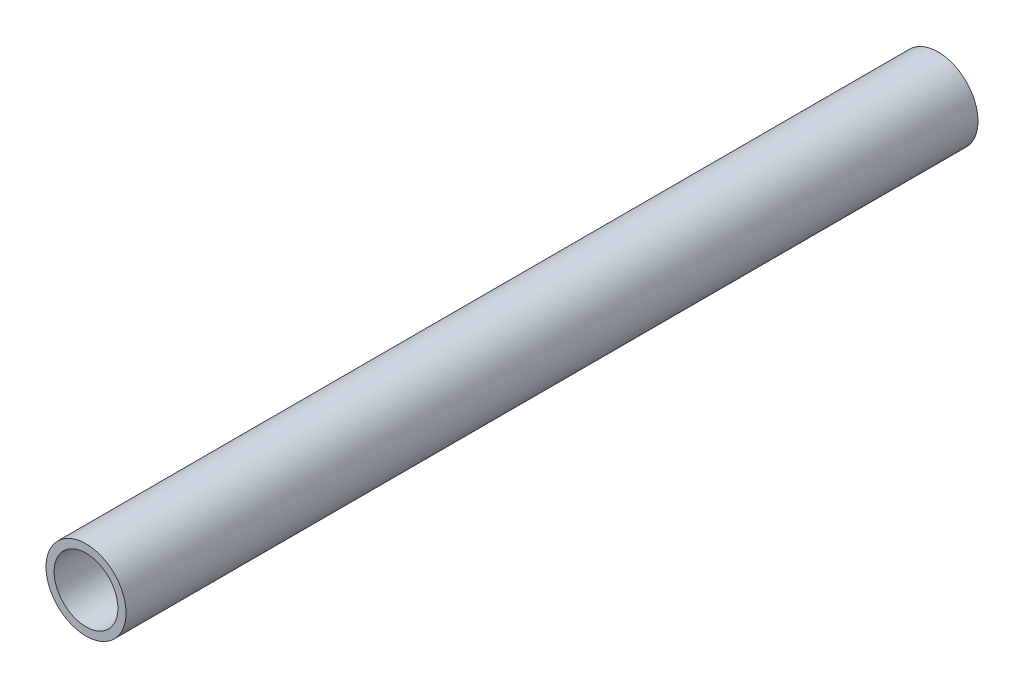
ISO-10303-21;
HEADER;
FILE_DESCRIPTION(('STEP AP214'),'2;1');
FILE_NAME('part.step','',(''),(''),'','','');
FILE_SCHEMA(('AUTOMOTIVE_DESIGN { 1 0 10303 214 1 1 1 1 }'));
ENDSEC;
DATA;
#1=APPLICATION_CONTEXT('core data for automotive mechanical design processes');
#2=APPLICATION_PROTOCOL_DEFINITION('international standard','automotive_design',2000,#1);
#3=PRODUCT_CONTEXT('',#1,'mechanical');
#4=PRODUCT('Part','Part','',(#3));
#5=PRODUCT_RELATED_PRODUCT_CATEGORY('part','',(#4));
#6=PRODUCT_DEFINITION_FORMATION('','',#4);
#7=PRODUCT_DEFINITION_CONTEXT('part definition',#1,'design');
#8=PRODUCT_DEFINITION('design','',#6,#7);
#9=PRODUCT_DEFINITION_SHAPE('','',#8);
#10=(LENGTH_UNIT() NAMED_UNIT(*) SI_UNIT(.MILLI.,.METRE.));
#11=(NAMED_UNIT(*) PLANE_ANGLE_UNIT() SI_UNIT($,.RADIAN.));
#12=(NAMED_UNIT(*) SI_UNIT($,.STERADIAN.) SOLID_ANGLE_UNIT());
#13=UNCERTAINTY_MEASURE_WITH_UNIT(LENGTH_MEASURE(1.E-05),#10,'distance_accuracy_value','');
#14=(GEOMETRIC_REPRESENTATION_CONTEXT(3) GLOBAL_UNCERTAINTY_ASSIGNED_CONTEXT((#13)) GLOBAL_UNIT_ASSIGNED_CONTEXT((#10,
#11,#12)) REPRESENTATION_CONTEXT('',''));
#15=CARTESIAN_POINT('',(0.,0.,0.));
#16=DIRECTION('',(0.,0.,1.));
#17=DIRECTION('',(1.,0.,0.));
#18=AXIS2_PLACEMENT_3D('',#15,#16,#17);
#19=CARTESIAN_POINT('',(0.,0.,0.));
#20=DIRECTION('',(0.,0.,1.));
#21=DIRECTION('',(1.,0.,0.));
#22=AXIS2_PLACEMENT_3D('',#19,#20,#21);
#23=CYLINDRICAL_SURFACE('',#22,13.3223);
#24=CARTESIAN_POINT('',(0.,0.,355.6));
#25=DIRECTION('',(0.,0.,1.));
#26=DIRECTION('',(1.,0.,0.));
#27=AXIS2_PLACEMENT_3D('',#24,#25,#26);
#28=CIRCLE('',#27,13.3223);
#29=CARTESIAN_POINT('',(13.3223,0.,355.6));
#30=VERTEX_POINT('',#29);
#31=EDGE_CURVE('E9',#30,#30,#28,.T.);
#32=ORIENTED_EDGE('',*,*,#31,.T.);
#33=EDGE_LOOP('',(#32));
#34=FACE_BOUND('',#33,.T.);
#35=CARTESIAN_POINT('',(0.,0.,0.));
#36=DIRECTION('',(0.,0.,1.));
#37=DIRECTION('',(1.,0.,0.));
#38=AXIS2_PLACEMENT_3D('',#35,#36,#37);
#39=CIRCLE('',#38,13.3223);
#40=CARTESIAN_POINT('',(13.3223,0.,0.));
#41=VERTEX_POINT('',#40);
#42=EDGE_CURVE('E28',#41,#41,#39,.T.);
#43=ORIENTED_EDGE('',*,*,#42,.F.);
#44=EDGE_LOOP('',(#43));
#45=FACE_BOUND('',#44,.T.);
#46=ADVANCED_FACE('F14',(#34,#45),#23,.F.);
#47=CARTESIAN_POINT('',(0.,0.,0.));
#48=DIRECTION('',(0.,0.,1.));
#49=DIRECTION('',(1.,0.,0.));
#50=AXIS2_PLACEMENT_3D('',#47,#48,#49);
#51=CYLINDRICAL_SURFACE('',#50,16.7005);
#52=CARTESIAN_POINT('',(0.,0.,355.6));
#53=DIRECTION('',(0.,0.,-1.));
#54=DIRECTION('',(0.,-1.,0.));
#55=AXIS2_PLACEMENT_3D('',#52,#53,#54);
#56=CIRCLE('',#55,16.7005);
#57=CARTESIAN_POINT('',(0.,-16.7005,355.6));
#58=VERTEX_POINT('',#57);
#59=EDGE_CURVE('E22',#58,#58,#56,.T.);
#60=ORIENTED_EDGE('',*,*,#59,.T.);
#61=EDGE_LOOP('',(#60));
#62=FACE_BOUND('',#61,.T.);
#63=CARTESIAN_POINT('',(0.,0.,0.));
#64=DIRECTION('',(0.,0.,-1.));
#65=DIRECTION('',(0.,-1.,0.));
#66=AXIS2_PLACEMENT_3D('',#63,#64,#65);
#67=CIRCLE('',#66,16.7005);
#68=CARTESIAN_POINT('',(0.,-16.7005,0.));
#69=VERTEX_POINT('',#68);
#70=EDGE_CURVE('E18',#69,#69,#67,.T.);
#71=ORIENTED_EDGE('',*,*,#70,.F.);
#72=EDGE_LOOP('',(#71));
#73=FACE_BOUND('',#72,.T.);
#74=ADVANCED_FACE('F16',(#62,#73),#51,.T.);
#75=CARTESIAN_POINT('',(0.,0.,0.));
#76=DIRECTION('',(0.,0.,1.));
#77=DIRECTION('',(1.,0.,0.));
#78=AXIS2_PLACEMENT_3D('',#75,#76,#77);
#79=PLANE('',#78);
#80=ORIENTED_EDGE('',*,*,#70,.T.);
#81=EDGE_LOOP('',(#80));
#82=FACE_BOUND('',#81,.T.);
#83=ORIENTED_EDGE('',*,*,#42,.T.);
#84=EDGE_LOOP('',(#83));
#85=FACE_BOUND('',#84,.T.);
#86=ADVANCED_FACE('F35',(#82,#85),#79,.F.);
#87=CARTESIAN_POINT('',(0.,0.,355.6));
#88=DIRECTION('',(0.,0.,1.));
#89=DIRECTION('',(1.,0.,0.));
#90=AXIS2_PLACEMENT_3D('',#87,#88,#89);
#91=PLANE('',#90);
#92=ORIENTED_EDGE('',*,*,#59,.F.);
#93=EDGE_LOOP('',(#92));
#94=FACE_BOUND('',#93,.T.);
#95=ORIENTED_EDGE('',*,*,#31,.F.);
#96=EDGE_LOOP('',(#95));
#97=FACE_BOUND('',#96,.T.);
#98=ADVANCED_FACE('F44',(#94,#97),#91,.T.);
#99=CLOSED_SHELL('',(#46,#74,#86,#98));
#100=MANIFOLD_SOLID_BREP('B1',#99);
#101=ADVANCED_BREP_SHAPE_REPRESENTATION('',(#18,#100),#14);
#102=SHAPE_DEFINITION_REPRESENTATION(#9,#101);
ENDSEC;
END-ISO-10303-21;
